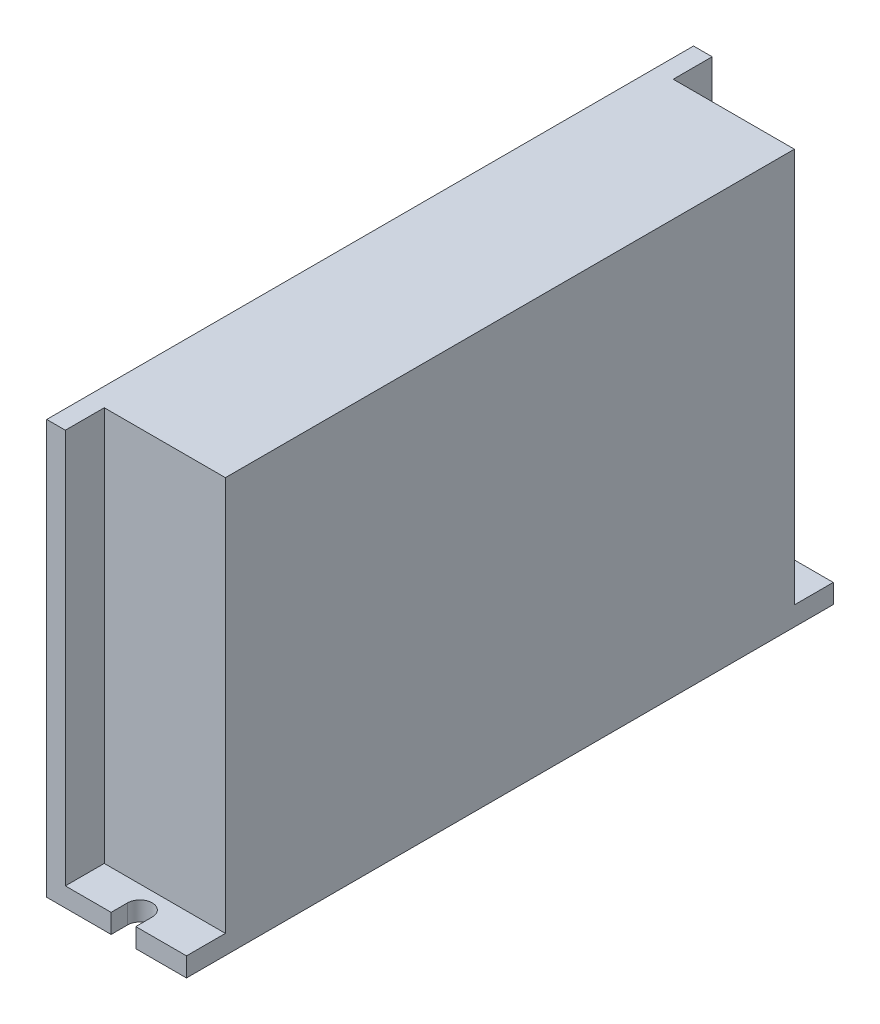
ISO-10303-21;
HEADER;
FILE_DESCRIPTION(('STEP AP214'),'2;1');
FILE_NAME('part.step','',(''),(''),'','','');
FILE_SCHEMA(('AUTOMOTIVE_DESIGN { 1 0 10303 214 1 1 1 1 }'));
ENDSEC;
DATA;
#1=APPLICATION_CONTEXT('core data for automotive mechanical design processes');
#2=APPLICATION_PROTOCOL_DEFINITION('international standard','automotive_design',2000,#1);
#3=PRODUCT_CONTEXT('',#1,'mechanical');
#4=PRODUCT('Part','Part','',(#3));
#5=PRODUCT_RELATED_PRODUCT_CATEGORY('part','',(#4));
#6=PRODUCT_DEFINITION_FORMATION('','',#4);
#7=PRODUCT_DEFINITION_CONTEXT('part definition',#1,'design');
#8=PRODUCT_DEFINITION('design','',#6,#7);
#9=PRODUCT_DEFINITION_SHAPE('','',#8);
#10=(LENGTH_UNIT() NAMED_UNIT(*) SI_UNIT(.MILLI.,.METRE.));
#11=(NAMED_UNIT(*) PLANE_ANGLE_UNIT() SI_UNIT($,.RADIAN.));
#12=(NAMED_UNIT(*) SI_UNIT($,.STERADIAN.) SOLID_ANGLE_UNIT());
#13=UNCERTAINTY_MEASURE_WITH_UNIT(LENGTH_MEASURE(1.E-05),#10,'distance_accuracy_value','');
#14=(GEOMETRIC_REPRESENTATION_CONTEXT(3) GLOBAL_UNCERTAINTY_ASSIGNED_CONTEXT((#13)) GLOBAL_UNIT_ASSIGNED_CONTEXT((#10,
#11,#12)) REPRESENTATION_CONTEXT('',''));
#15=CARTESIAN_POINT('',(0.,0.,0.));
#16=DIRECTION('',(0.,0.,1.));
#17=DIRECTION('',(1.,0.,0.));
#18=AXIS2_PLACEMENT_3D('',#15,#16,#17);
#19=CARTESIAN_POINT('',(0.,3.5,0.));
#20=DIRECTION('',(0.,-1.,0.));
#21=DIRECTION('',(0.,0.,-1.));
#22=AXIS2_PLACEMENT_3D('',#19,#20,#21);
#23=PLANE('',#22);
#24=DIRECTION('',(-1.,0.,0.));
#25=VECTOR('',#24,1.);
#26=CARTESIAN_POINT('',(-9.35,3.5,-51.9));
#27=LINE('',#26,#25);
#28=CARTESIAN_POINT('',(12.75,3.5,-51.9));
#29=VERTEX_POINT('',#28);
#30=CARTESIAN_POINT('',(-9.35,3.5,-51.9));
#31=VERTEX_POINT('',#30);
#32=EDGE_CURVE('E332',#29,#31,#27,.T.);
#33=ORIENTED_EDGE('',*,*,#32,.F.);
#34=DIRECTION('',(0.,0.,-1.));
#35=VECTOR('',#34,1.);
#36=CARTESIAN_POINT('',(12.75,3.5,59.));
#37=LINE('',#36,#35);
#38=CARTESIAN_POINT('',(12.75,3.5,-59.));
#39=VERTEX_POINT('',#38);
#40=EDGE_CURVE('E188',#29,#39,#37,.T.);
#41=ORIENTED_EDGE('',*,*,#40,.T.);
#42=DIRECTION('',(-1.,0.,0.));
#43=VECTOR('',#42,1.);
#44=CARTESIAN_POINT('',(-12.75,3.5,-59.));
#45=LINE('',#44,#43);
#46=CARTESIAN_POINT('',(3.49999999999999,3.5,-59.));
#47=VERTEX_POINT('',#46);
#48=EDGE_CURVE('E270',#39,#47,#45,.T.);
#49=ORIENTED_EDGE('',*,*,#48,.T.);
#50=DIRECTION('',(0.,0.,-1.));
#51=VECTOR('',#50,1.);
#52=CARTESIAN_POINT('',(3.49999999999999,3.5,-56.));
#53=LINE('',#52,#51);
#54=CARTESIAN_POINT('',(3.49999999999999,3.5,-56.));
#55=VERTEX_POINT('',#54);
#56=EDGE_CURVE('E254',#55,#47,#53,.T.);
#57=ORIENTED_EDGE('',*,*,#56,.F.);
#58=CARTESIAN_POINT('',(1.24999999999999,3.5,-56.));
#59=DIRECTION('',(0.,1.,0.));
#60=DIRECTION('',(0.,0.,1.));
#61=AXIS2_PLACEMENT_3D('',#58,#59,#60);
#62=CIRCLE('',#61,2.25);
#63=CARTESIAN_POINT('',(-1.00000000000001,3.5,-56.));
#64=VERTEX_POINT('',#63);
#65=EDGE_CURVE('E228',#64,#55,#62,.T.);
#66=ORIENTED_EDGE('',*,*,#65,.F.);
#67=DIRECTION('',(0.,0.,1.));
#68=VECTOR('',#67,1.);
#69=CARTESIAN_POINT('',(-1.00000000000001,3.5,-56.));
#70=LINE('',#69,#68);
#71=CARTESIAN_POINT('',(-1.00000000000002,3.5,-59.));
#72=VERTEX_POINT('',#71);
#73=EDGE_CURVE('E251',#72,#64,#70,.T.);
#74=ORIENTED_EDGE('',*,*,#73,.F.);
#75=CARTESIAN_POINT('',(-9.35,3.5,-59.));
#76=VERTEX_POINT('',#75);
#77=EDGE_CURVE('E269',#72,#76,#45,.T.);
#78=ORIENTED_EDGE('',*,*,#77,.T.);
#79=DIRECTION('',(0.,0.,-1.));
#80=VECTOR('',#79,1.);
#81=CARTESIAN_POINT('',(-9.35,3.5,-59.));
#82=LINE('',#81,#80);
#83=EDGE_CURVE('E189',#31,#76,#82,.T.);
#84=ORIENTED_EDGE('',*,*,#83,.F.);
#85=EDGE_LOOP('',(#33,#41,#49,#57,#66,#74,#78,#84));
#86=FACE_BOUND('',#85,.T.);
#87=ADVANCED_FACE('F42',(#86),#23,.F.);
#88=DIRECTION('',(1.,0.,0.));
#89=VECTOR('',#88,1.);
#90=CARTESIAN_POINT('',(-9.35,3.5,51.9));
#91=LINE('',#90,#89);
#92=CARTESIAN_POINT('',(-9.35,3.5,51.9));
#93=VERTEX_POINT('',#92);
#94=CARTESIAN_POINT('',(12.75,3.5,51.9));
#95=VERTEX_POINT('',#94);
#96=EDGE_CURVE('E183',#93,#95,#91,.T.);
#97=ORIENTED_EDGE('',*,*,#96,.F.);
#98=CARTESIAN_POINT('',(-9.34999999999999,3.5,59.));
#99=VERTEX_POINT('',#98);
#100=EDGE_CURVE('E65',#99,#93,#82,.T.);
#101=ORIENTED_EDGE('',*,*,#100,.F.);
#102=DIRECTION('',(1.,0.,0.));
#103=VECTOR('',#102,1.);
#104=CARTESIAN_POINT('',(-12.75,3.5,59.));
#105=LINE('',#104,#103);
#106=CARTESIAN_POINT('',(-1.,3.5,59.));
#107=VERTEX_POINT('',#106);
#108=EDGE_CURVE('E274',#99,#107,#105,.T.);
#109=ORIENTED_EDGE('',*,*,#108,.T.);
#110=DIRECTION('',(0.,0.,1.));
#111=VECTOR('',#110,1.);
#112=CARTESIAN_POINT('',(-1.,3.5,56.));
#113=LINE('',#112,#111);
#114=CARTESIAN_POINT('',(-1.,3.5,56.));
#115=VERTEX_POINT('',#114);
#116=EDGE_CURVE('E227',#115,#107,#113,.T.);
#117=ORIENTED_EDGE('',*,*,#116,.F.);
#118=CARTESIAN_POINT('',(1.25,3.5,56.));
#119=DIRECTION('',(0.,1.,0.));
#120=DIRECTION('',(0.,0.,1.));
#121=AXIS2_PLACEMENT_3D('',#118,#119,#120);
#122=CIRCLE('',#121,2.25);
#123=CARTESIAN_POINT('',(3.5,3.5,56.));
#124=VERTEX_POINT('',#123);
#125=EDGE_CURVE('E224',#124,#115,#122,.T.);
#126=ORIENTED_EDGE('',*,*,#125,.F.);
#127=DIRECTION('',(0.,0.,-1.));
#128=VECTOR('',#127,1.);
#129=CARTESIAN_POINT('',(3.5,3.5,56.));
#130=LINE('',#129,#128);
#131=CARTESIAN_POINT('',(3.5,3.5,59.));
#132=VERTEX_POINT('',#131);
#133=EDGE_CURVE('E217',#132,#124,#130,.T.);
#134=ORIENTED_EDGE('',*,*,#133,.F.);
#135=CARTESIAN_POINT('',(12.75,3.5,59.));
#136=VERTEX_POINT('',#135);
#137=EDGE_CURVE('E273',#132,#136,#105,.T.);
#138=ORIENTED_EDGE('',*,*,#137,.T.);
#139=EDGE_CURVE('E266',#136,#95,#37,.T.);
#140=ORIENTED_EDGE('',*,*,#139,.T.);
#141=EDGE_LOOP('',(#97,#101,#109,#117,#126,#134,#138,#140));
#142=FACE_BOUND('',#141,.T.);
#143=ADVANCED_FACE('F342',(#142),#23,.F.);
#144=CARTESIAN_POINT('',(-9.35,75.5,-59.));
#145=DIRECTION('',(-1.,0.,0.));
#146=DIRECTION('',(0.,0.,1.));
#147=AXIS2_PLACEMENT_3D('',#144,#145,#146);
#148=PLANE('',#147);
#149=DIRECTION('',(0.,-1.,0.));
#150=VECTOR('',#149,1.);
#151=CARTESIAN_POINT('',(-9.35,75.5,-51.9));
#152=LINE('',#151,#150);
#153=CARTESIAN_POINT('',(-9.35,75.5,-51.9));
#154=VERTEX_POINT('',#153);
#155=EDGE_CURVE('E57',#154,#31,#152,.T.);
#156=ORIENTED_EDGE('',*,*,#155,.T.);
#157=ORIENTED_EDGE('',*,*,#83,.T.);
#158=DIRECTION('',(0.,-1.,0.));
#159=VECTOR('',#158,1.);
#160=CARTESIAN_POINT('',(-9.35,75.5,-59.));
#161=LINE('',#160,#159);
#162=CARTESIAN_POINT('',(-9.35,75.5,-59.));
#163=VERTEX_POINT('',#162);
#164=EDGE_CURVE('E205',#163,#76,#161,.T.);
#165=ORIENTED_EDGE('',*,*,#164,.F.);
#166=DIRECTION('',(0.,0.,-1.));
#167=VECTOR('',#166,1.);
#168=CARTESIAN_POINT('',(-9.35,75.5,-59.));
#169=LINE('',#168,#167);
#170=EDGE_CURVE('E200',#154,#163,#169,.T.);
#171=ORIENTED_EDGE('',*,*,#170,.F.);
#172=EDGE_LOOP('',(#156,#157,#165,#171));
#173=FACE_BOUND('',#172,.T.);
#174=ADVANCED_FACE('F315',(#173),#148,.F.);
#175=DIRECTION('',(0.,-1.,0.));
#176=VECTOR('',#175,1.);
#177=CARTESIAN_POINT('',(-9.35,75.5,51.9));
#178=LINE('',#177,#176);
#179=CARTESIAN_POINT('',(-9.35,75.5,51.9));
#180=VERTEX_POINT('',#179);
#181=EDGE_CURVE('E192',#180,#93,#178,.T.);
#182=ORIENTED_EDGE('',*,*,#181,.F.);
#183=CARTESIAN_POINT('',(-9.34999999999999,75.5,59.));
#184=VERTEX_POINT('',#183);
#185=EDGE_CURVE('E201',#184,#180,#169,.T.);
#186=ORIENTED_EDGE('',*,*,#185,.F.);
#187=DIRECTION('',(0.,-1.,0.));
#188=VECTOR('',#187,1.);
#189=CARTESIAN_POINT('',(-9.34999999999999,75.5,59.));
#190=LINE('',#189,#188);
#191=EDGE_CURVE('E209',#184,#99,#190,.T.);
#192=ORIENTED_EDGE('',*,*,#191,.T.);
#193=ORIENTED_EDGE('',*,*,#100,.T.);
#194=EDGE_LOOP('',(#182,#186,#192,#193));
#195=FACE_BOUND('',#194,.T.);
#196=ADVANCED_FACE('F344',(#195),#148,.F.);
#197=CARTESIAN_POINT('',(-12.75,3.5,-59.));
#198=DIRECTION('',(0.,0.,1.));
#199=DIRECTION('',(1.,0.,0.));
#200=AXIS2_PLACEMENT_3D('',#197,#198,#199);
#201=PLANE('',#200);
#202=ORIENTED_EDGE('',*,*,#77,.F.);
#203=DIRECTION('',(0.,1.,0.));
#204=VECTOR('',#203,1.);
#205=CARTESIAN_POINT('',(-1.00000000000002,0.,-59.));
#206=LINE('',#205,#204);
#207=CARTESIAN_POINT('',(-1.00000000000002,0.,-59.));
#208=VERTEX_POINT('',#207);
#209=EDGE_CURVE('E248',#208,#72,#206,.T.);
#210=ORIENTED_EDGE('',*,*,#209,.F.);
#211=DIRECTION('',(-1.,0.,0.));
#212=VECTOR('',#211,1.);
#213=CARTESIAN_POINT('',(-12.75,0.,-59.));
#214=LINE('',#213,#212);
#215=CARTESIAN_POINT('',(-12.75,0.,-59.));
#216=VERTEX_POINT('',#215);
#217=EDGE_CURVE('E278',#208,#216,#214,.T.);
#218=ORIENTED_EDGE('',*,*,#217,.T.);
#219=DIRECTION('',(0.,-1.,0.));
#220=VECTOR('',#219,1.);
#221=CARTESIAN_POINT('',(-12.75,3.5,-59.));
#222=LINE('',#221,#220);
#223=CARTESIAN_POINT('',(-12.75,75.5,-59.));
#224=VERTEX_POINT('',#223);
#225=EDGE_CURVE('E50',#224,#216,#222,.T.);
#226=ORIENTED_EDGE('',*,*,#225,.F.);
#227=DIRECTION('',(-1.,0.,0.));
#228=VECTOR('',#227,1.);
#229=CARTESIAN_POINT('',(-12.75,75.5,-59.));
#230=LINE('',#229,#228);
#231=EDGE_CURVE('E203',#163,#224,#230,.T.);
#232=ORIENTED_EDGE('',*,*,#231,.F.);
#233=ORIENTED_EDGE('',*,*,#164,.T.);
#234=EDGE_LOOP('',(#202,#210,#218,#226,#232,#233));
#235=FACE_BOUND('',#234,.T.);
#236=ADVANCED_FACE('F311',(#235),#201,.F.);
#237=CARTESIAN_POINT('',(-12.75,3.5,59.));
#238=DIRECTION('',(0.,0.,-1.));
#239=DIRECTION('',(-1.,0.,0.));
#240=AXIS2_PLACEMENT_3D('',#237,#238,#239);
#241=PLANE('',#240);
#242=ORIENTED_EDGE('',*,*,#137,.F.);
#243=DIRECTION('',(0.,1.,0.));
#244=VECTOR('',#243,1.);
#245=CARTESIAN_POINT('',(3.5,0.,59.));
#246=LINE('',#245,#244);
#247=CARTESIAN_POINT('',(3.5,0.,59.));
#248=VERTEX_POINT('',#247);
#249=EDGE_CURVE('E236',#248,#132,#246,.T.);
#250=ORIENTED_EDGE('',*,*,#249,.F.);
#251=DIRECTION('',(1.,0.,0.));
#252=VECTOR('',#251,1.);
#253=CARTESIAN_POINT('',(-12.75,0.,59.));
#254=LINE('',#253,#252);
#255=CARTESIAN_POINT('',(12.75,0.,59.));
#256=VERTEX_POINT('',#255);
#257=EDGE_CURVE('E284',#248,#256,#254,.T.);
#258=ORIENTED_EDGE('',*,*,#257,.T.);
#259=DIRECTION('',(0.,-1.,0.));
#260=VECTOR('',#259,1.);
#261=CARTESIAN_POINT('',(12.75,3.5,59.));
#262=LINE('',#261,#260);
#263=EDGE_CURVE('E276',#136,#256,#262,.T.);
#264=ORIENTED_EDGE('',*,*,#263,.F.);
#265=EDGE_LOOP('',(#242,#250,#258,#264));
#266=FACE_BOUND('',#265,.T.);
#267=ADVANCED_FACE('F351',(#266),#241,.F.);
#268=CARTESIAN_POINT('',(12.75,3.5,59.));
#269=DIRECTION('',(-1.,0.,0.));
#270=DIRECTION('',(0.,0.,1.));
#271=AXIS2_PLACEMENT_3D('',#268,#269,#270);
#272=PLANE('',#271);
#273=DIRECTION('',(0.,0.,-1.));
#274=VECTOR('',#273,1.);
#275=CARTESIAN_POINT('',(12.75,0.,59.));
#276=LINE('',#275,#274);
#277=CARTESIAN_POINT('',(12.75,0.,-59.));
#278=VERTEX_POINT('',#277);
#279=EDGE_CURVE('E235',#256,#278,#276,.T.);
#280=ORIENTED_EDGE('',*,*,#279,.T.);
#281=DIRECTION('',(0.,-1.,0.));
#282=VECTOR('',#281,1.);
#283=CARTESIAN_POINT('',(12.75,3.5,-59.));
#284=LINE('',#283,#282);
#285=EDGE_CURVE('E11',#39,#278,#284,.T.);
#286=ORIENTED_EDGE('',*,*,#285,.F.);
#287=ORIENTED_EDGE('',*,*,#40,.F.);
#288=DIRECTION('',(0.,-1.,0.));
#289=VECTOR('',#288,1.);
#290=CARTESIAN_POINT('',(12.75,75.5,-51.9));
#291=LINE('',#290,#289);
#292=CARTESIAN_POINT('',(12.75,75.5,-51.9));
#293=VERTEX_POINT('',#292);
#294=EDGE_CURVE('E169',#293,#29,#291,.T.);
#295=ORIENTED_EDGE('',*,*,#294,.F.);
#296=DIRECTION('',(0.,0.,-1.));
#297=VECTOR('',#296,1.);
#298=CARTESIAN_POINT('',(12.75,75.5,51.9));
#299=LINE('',#298,#297);
#300=CARTESIAN_POINT('',(12.75,75.5,51.9));
#301=VERTEX_POINT('',#300);
#302=EDGE_CURVE('E174',#301,#293,#299,.T.);
#303=ORIENTED_EDGE('',*,*,#302,.F.);
#304=DIRECTION('',(0.,-1.,0.));
#305=VECTOR('',#304,1.);
#306=CARTESIAN_POINT('',(12.75,75.5,51.9));
#307=LINE('',#306,#305);
#308=EDGE_CURVE('E337',#301,#95,#307,.T.);
#309=ORIENTED_EDGE('',*,*,#308,.T.);
#310=ORIENTED_EDGE('',*,*,#139,.F.);
#311=ORIENTED_EDGE('',*,*,#263,.T.);
#312=EDGE_LOOP('',(#280,#286,#287,#295,#303,#309,#310,#311));
#313=FACE_BOUND('',#312,.T.);
#314=ADVANCED_FACE('F44',(#313),#272,.F.);
#315=CARTESIAN_POINT('',(3.49999999999999,0.,-59.));
#316=VERTEX_POINT('',#315);
#317=EDGE_CURVE('E279',#278,#316,#214,.T.);
#318=ORIENTED_EDGE('',*,*,#317,.T.);
#319=DIRECTION('',(0.,1.,0.));
#320=VECTOR('',#319,1.);
#321=CARTESIAN_POINT('',(3.49999999999999,0.,-59.));
#322=LINE('',#321,#320);
#323=EDGE_CURVE('E245',#316,#47,#322,.T.);
#324=ORIENTED_EDGE('',*,*,#323,.T.);
#325=ORIENTED_EDGE('',*,*,#48,.F.);
#326=ORIENTED_EDGE('',*,*,#285,.T.);
#327=EDGE_LOOP('',(#318,#324,#325,#326));
#328=FACE_BOUND('',#327,.T.);
#329=ADVANCED_FACE('F331',(#328),#201,.F.);
#330=CARTESIAN_POINT('',(-12.75,3.5,59.));
#331=DIRECTION('',(1.,0.,0.));
#332=DIRECTION('',(0.,0.,-1.));
#333=AXIS2_PLACEMENT_3D('',#330,#331,#332);
#334=PLANE('',#333);
#335=DIRECTION('',(0.,0.,1.));
#336=VECTOR('',#335,1.);
#337=CARTESIAN_POINT('',(-12.75,0.,59.));
#338=LINE('',#337,#336);
#339=CARTESIAN_POINT('',(-12.75,0.,59.));
#340=VERTEX_POINT('',#339);
#341=EDGE_CURVE('E282',#216,#340,#338,.T.);
#342=ORIENTED_EDGE('',*,*,#341,.T.);
#343=DIRECTION('',(0.,-1.,0.));
#344=VECTOR('',#343,1.);
#345=CARTESIAN_POINT('',(-12.75,3.5,59.));
#346=LINE('',#345,#344);
#347=CARTESIAN_POINT('',(-12.75,75.5,59.));
#348=VERTEX_POINT('',#347);
#349=EDGE_CURVE('E290',#348,#340,#346,.T.);
#350=ORIENTED_EDGE('',*,*,#349,.F.);
#351=DIRECTION('',(0.,0.,1.));
#352=VECTOR('',#351,1.);
#353=CARTESIAN_POINT('',(-12.75,75.5,-59.));
#354=LINE('',#353,#352);
#355=EDGE_CURVE('E196',#224,#348,#354,.T.);
#356=ORIENTED_EDGE('',*,*,#355,.F.);
#357=ORIENTED_EDGE('',*,*,#225,.T.);
#358=EDGE_LOOP('',(#342,#350,#356,#357));
#359=FACE_BOUND('',#358,.T.);
#360=ADVANCED_FACE('F296',(#359),#334,.F.);
#361=CARTESIAN_POINT('',(-1.,0.,59.));
#362=VERTEX_POINT('',#361);
#363=EDGE_CURVE('E285',#340,#362,#254,.T.);
#364=ORIENTED_EDGE('',*,*,#363,.T.);
#365=DIRECTION('',(0.,1.,0.));
#366=VECTOR('',#365,1.);
#367=CARTESIAN_POINT('',(-1.,0.,59.));
#368=LINE('',#367,#366);
#369=EDGE_CURVE('E238',#362,#107,#368,.T.);
#370=ORIENTED_EDGE('',*,*,#369,.T.);
#371=ORIENTED_EDGE('',*,*,#108,.F.);
#372=ORIENTED_EDGE('',*,*,#191,.F.);
#373=DIRECTION('',(1.,0.,0.));
#374=VECTOR('',#373,1.);
#375=CARTESIAN_POINT('',(-12.75,75.5,59.));
#376=LINE('',#375,#374);
#377=EDGE_CURVE('E198',#348,#184,#376,.T.);
#378=ORIENTED_EDGE('',*,*,#377,.F.);
#379=ORIENTED_EDGE('',*,*,#349,.T.);
#380=EDGE_LOOP('',(#364,#370,#371,#372,#378,#379));
#381=FACE_BOUND('',#380,.T.);
#382=ADVANCED_FACE('F305',(#381),#241,.F.);
#383=CARTESIAN_POINT('',(0.,0.,0.));
#384=DIRECTION('',(0.,-1.,0.));
#385=DIRECTION('',(0.,0.,-1.));
#386=AXIS2_PLACEMENT_3D('',#383,#384,#385);
#387=PLANE('',#386);
#388=DIRECTION('',(0.,0.,-1.));
#389=VECTOR('',#388,1.);
#390=CARTESIAN_POINT('',(3.5,0.,56.));
#391=LINE('',#390,#389);
#392=CARTESIAN_POINT('',(3.5,0.,56.));
#393=VERTEX_POINT('',#392);
#394=EDGE_CURVE('E220',#248,#393,#391,.T.);
#395=ORIENTED_EDGE('',*,*,#394,.T.);
#396=CARTESIAN_POINT('',(1.25,0.,56.));
#397=DIRECTION('',(0.,1.,0.));
#398=DIRECTION('',(0.,0.,1.));
#399=AXIS2_PLACEMENT_3D('',#396,#397,#398);
#400=CIRCLE('',#399,2.25);
#401=CARTESIAN_POINT('',(-1.,0.,56.));
#402=VERTEX_POINT('',#401);
#403=EDGE_CURVE('E213',#393,#402,#400,.T.);
#404=ORIENTED_EDGE('',*,*,#403,.T.);
#405=DIRECTION('',(0.,0.,1.));
#406=VECTOR('',#405,1.);
#407=CARTESIAN_POINT('',(-1.,0.,56.));
#408=LINE('',#407,#406);
#409=EDGE_CURVE('E216',#402,#362,#408,.T.);
#410=ORIENTED_EDGE('',*,*,#409,.T.);
#411=ORIENTED_EDGE('',*,*,#363,.F.);
#412=ORIENTED_EDGE('',*,*,#341,.F.);
#413=ORIENTED_EDGE('',*,*,#217,.F.);
#414=DIRECTION('',(0.,0.,1.));
#415=VECTOR('',#414,1.);
#416=CARTESIAN_POINT('',(-1.00000000000001,0.,-56.));
#417=LINE('',#416,#415);
#418=CARTESIAN_POINT('',(-1.00000000000001,0.,-56.));
#419=VERTEX_POINT('',#418);
#420=EDGE_CURVE('E244',#208,#419,#417,.T.);
#421=ORIENTED_EDGE('',*,*,#420,.T.);
#422=CARTESIAN_POINT('',(1.24999999999999,0.,-56.));
#423=DIRECTION('',(0.,1.,0.));
#424=DIRECTION('',(0.,0.,1.));
#425=AXIS2_PLACEMENT_3D('',#422,#423,#424);
#426=CIRCLE('',#425,2.25);
#427=CARTESIAN_POINT('',(3.49999999999999,0.,-56.));
#428=VERTEX_POINT('',#427);
#429=EDGE_CURVE('E255',#419,#428,#426,.T.);
#430=ORIENTED_EDGE('',*,*,#429,.T.);
#431=DIRECTION('',(0.,0.,-1.));
#432=VECTOR('',#431,1.);
#433=CARTESIAN_POINT('',(3.49999999999999,0.,-56.));
#434=LINE('',#433,#432);
#435=EDGE_CURVE('E261',#428,#316,#434,.T.);
#436=ORIENTED_EDGE('',*,*,#435,.T.);
#437=ORIENTED_EDGE('',*,*,#317,.F.);
#438=ORIENTED_EDGE('',*,*,#279,.F.);
#439=ORIENTED_EDGE('',*,*,#257,.F.);
#440=EDGE_LOOP('',(#395,#404,#410,#411,#412,#413,#421,#430,#436,#437,#438,#439));
#441=FACE_BOUND('',#440,.T.);
#442=ADVANCED_FACE('F302',(#441),#387,.T.);
#443=CARTESIAN_POINT('',(1.24999999999999,0.,-56.));
#444=DIRECTION('',(0.,1.,0.));
#445=DIRECTION('',(0.,0.,1.));
#446=AXIS2_PLACEMENT_3D('',#443,#444,#445);
#447=CYLINDRICAL_SURFACE('',#446,2.25);
#448=ORIENTED_EDGE('',*,*,#65,.T.);
#449=DIRECTION('',(0.,1.,0.));
#450=VECTOR('',#449,1.);
#451=CARTESIAN_POINT('',(3.49999999999999,0.,-56.));
#452=LINE('',#451,#450);
#453=EDGE_CURVE('E242',#428,#55,#452,.T.);
#454=ORIENTED_EDGE('',*,*,#453,.F.);
#455=ORIENTED_EDGE('',*,*,#429,.F.);
#456=DIRECTION('',(0.,1.,0.));
#457=VECTOR('',#456,1.);
#458=CARTESIAN_POINT('',(-1.00000000000001,0.,-56.));
#459=LINE('',#458,#457);
#460=EDGE_CURVE('E212',#419,#64,#459,.T.);
#461=ORIENTED_EDGE('',*,*,#460,.T.);
#462=EDGE_LOOP('',(#448,#454,#455,#461));
#463=FACE_BOUND('',#462,.T.);
#464=ADVANCED_FACE('F326',(#463),#447,.F.);
#465=CARTESIAN_POINT('',(-1.00000000000001,0.,-56.));
#466=DIRECTION('',(-1.,0.,0.));
#467=DIRECTION('',(0.,0.,1.));
#468=AXIS2_PLACEMENT_3D('',#465,#466,#467);
#469=PLANE('',#468);
#470=ORIENTED_EDGE('',*,*,#73,.T.);
#471=ORIENTED_EDGE('',*,*,#460,.F.);
#472=ORIENTED_EDGE('',*,*,#420,.F.);
#473=ORIENTED_EDGE('',*,*,#209,.T.);
#474=EDGE_LOOP('',(#470,#471,#472,#473));
#475=FACE_BOUND('',#474,.T.);
#476=ADVANCED_FACE('F322',(#475),#469,.F.);
#477=CARTESIAN_POINT('',(3.49999999999999,0.,-56.));
#478=DIRECTION('',(1.,0.,0.));
#479=DIRECTION('',(0.,0.,-1.));
#480=AXIS2_PLACEMENT_3D('',#477,#478,#479);
#481=PLANE('',#480);
#482=ORIENTED_EDGE('',*,*,#56,.T.);
#483=ORIENTED_EDGE('',*,*,#323,.F.);
#484=ORIENTED_EDGE('',*,*,#435,.F.);
#485=ORIENTED_EDGE('',*,*,#453,.T.);
#486=EDGE_LOOP('',(#482,#483,#484,#485));
#487=FACE_BOUND('',#486,.T.);
#488=ADVANCED_FACE('F328',(#487),#481,.F.);
#489=CARTESIAN_POINT('',(1.25,0.,56.));
#490=DIRECTION('',(0.,1.,0.));
#491=DIRECTION('',(0.,0.,1.));
#492=AXIS2_PLACEMENT_3D('',#489,#490,#491);
#493=CYLINDRICAL_SURFACE('',#492,2.25);
#494=ORIENTED_EDGE('',*,*,#125,.T.);
#495=DIRECTION('',(0.,1.,0.));
#496=VECTOR('',#495,1.);
#497=CARTESIAN_POINT('',(-1.,0.,56.));
#498=LINE('',#497,#496);
#499=EDGE_CURVE('E223',#402,#115,#498,.T.);
#500=ORIENTED_EDGE('',*,*,#499,.F.);
#501=ORIENTED_EDGE('',*,*,#403,.F.);
#502=DIRECTION('',(0.,1.,0.));
#503=VECTOR('',#502,1.);
#504=CARTESIAN_POINT('',(3.5,0.,56.));
#505=LINE('',#504,#503);
#506=EDGE_CURVE('E233',#393,#124,#505,.T.);
#507=ORIENTED_EDGE('',*,*,#506,.T.);
#508=EDGE_LOOP('',(#494,#500,#501,#507));
#509=FACE_BOUND('',#508,.T.);
#510=ADVANCED_FACE('F389',(#509),#493,.F.);
#511=CARTESIAN_POINT('',(3.5,0.,56.));
#512=DIRECTION('',(1.,0.,0.));
#513=DIRECTION('',(0.,0.,-1.));
#514=AXIS2_PLACEMENT_3D('',#511,#512,#513);
#515=PLANE('',#514);
#516=ORIENTED_EDGE('',*,*,#133,.T.);
#517=ORIENTED_EDGE('',*,*,#506,.F.);
#518=ORIENTED_EDGE('',*,*,#394,.F.);
#519=ORIENTED_EDGE('',*,*,#249,.T.);
#520=EDGE_LOOP('',(#516,#517,#518,#519));
#521=FACE_BOUND('',#520,.T.);
#522=ADVANCED_FACE('F385',(#521),#515,.F.);
#523=CARTESIAN_POINT('',(-1.,0.,56.));
#524=DIRECTION('',(-1.,0.,0.));
#525=DIRECTION('',(0.,0.,1.));
#526=AXIS2_PLACEMENT_3D('',#523,#524,#525);
#527=PLANE('',#526);
#528=ORIENTED_EDGE('',*,*,#116,.T.);
#529=ORIENTED_EDGE('',*,*,#369,.F.);
#530=ORIENTED_EDGE('',*,*,#409,.F.);
#531=ORIENTED_EDGE('',*,*,#499,.T.);
#532=EDGE_LOOP('',(#528,#529,#530,#531));
#533=FACE_BOUND('',#532,.T.);
#534=ADVANCED_FACE('F391',(#533),#527,.F.);
#535=CARTESIAN_POINT('',(0.,75.5,0.));
#536=DIRECTION('',(0.,1.,0.));
#537=DIRECTION('',(0.,0.,1.));
#538=AXIS2_PLACEMENT_3D('',#535,#536,#537);
#539=PLANE('',#538);
#540=ORIENTED_EDGE('',*,*,#355,.T.);
#541=ORIENTED_EDGE('',*,*,#377,.T.);
#542=ORIENTED_EDGE('',*,*,#185,.T.);
#543=DIRECTION('',(1.,0.,0.));
#544=VECTOR('',#543,1.);
#545=CARTESIAN_POINT('',(-9.35,75.5,51.9));
#546=LINE('',#545,#544);
#547=EDGE_CURVE('E173',#180,#301,#546,.T.);
#548=ORIENTED_EDGE('',*,*,#547,.T.);
#549=ORIENTED_EDGE('',*,*,#302,.T.);
#550=DIRECTION('',(-1.,0.,0.));
#551=VECTOR('',#550,1.);
#552=CARTESIAN_POINT('',(-9.35,75.5,-51.9));
#553=LINE('',#552,#551);
#554=EDGE_CURVE('E165',#293,#154,#553,.T.);
#555=ORIENTED_EDGE('',*,*,#554,.T.);
#556=ORIENTED_EDGE('',*,*,#170,.T.);
#557=ORIENTED_EDGE('',*,*,#231,.T.);
#558=EDGE_LOOP('',(#540,#541,#542,#548,#549,#555,#556,#557));
#559=FACE_BOUND('',#558,.T.);
#560=ADVANCED_FACE('F178',(#559),#539,.T.);
#561=CARTESIAN_POINT('',(-9.35,75.5,-51.9));
#562=DIRECTION('',(0.,0.,1.));
#563=DIRECTION('',(1.,0.,0.));
#564=AXIS2_PLACEMENT_3D('',#561,#562,#563);
#565=PLANE('',#564);
#566=ORIENTED_EDGE('',*,*,#32,.T.);
#567=ORIENTED_EDGE('',*,*,#155,.F.);
#568=ORIENTED_EDGE('',*,*,#554,.F.);
#569=ORIENTED_EDGE('',*,*,#294,.T.);
#570=EDGE_LOOP('',(#566,#567,#568,#569));
#571=FACE_BOUND('',#570,.T.);
#572=ADVANCED_FACE('F167',(#571),#565,.F.);
#573=CARTESIAN_POINT('',(-9.35,75.5,51.9));
#574=DIRECTION('',(0.,0.,-1.));
#575=DIRECTION('',(-1.,0.,0.));
#576=AXIS2_PLACEMENT_3D('',#573,#574,#575);
#577=PLANE('',#576);
#578=ORIENTED_EDGE('',*,*,#96,.T.);
#579=ORIENTED_EDGE('',*,*,#308,.F.);
#580=ORIENTED_EDGE('',*,*,#547,.F.);
#581=ORIENTED_EDGE('',*,*,#181,.T.);
#582=EDGE_LOOP('',(#578,#579,#580,#581));
#583=FACE_BOUND('',#582,.T.);
#584=ADVANCED_FACE('F340',(#583),#577,.F.);
#585=CLOSED_SHELL('',(#87,#143,#174,#196,#236,#267,#314,#329,#360,#382,#442,#464,#476,#488,#510,
#522,#534,#560,#572,#584));
#586=MANIFOLD_SOLID_BREP('B2',#585);
#587=ADVANCED_BREP_SHAPE_REPRESENTATION('',(#18,#586),#14);
#588=SHAPE_DEFINITION_REPRESENTATION(#9,#587);
ENDSEC;
END-ISO-10303-21;
